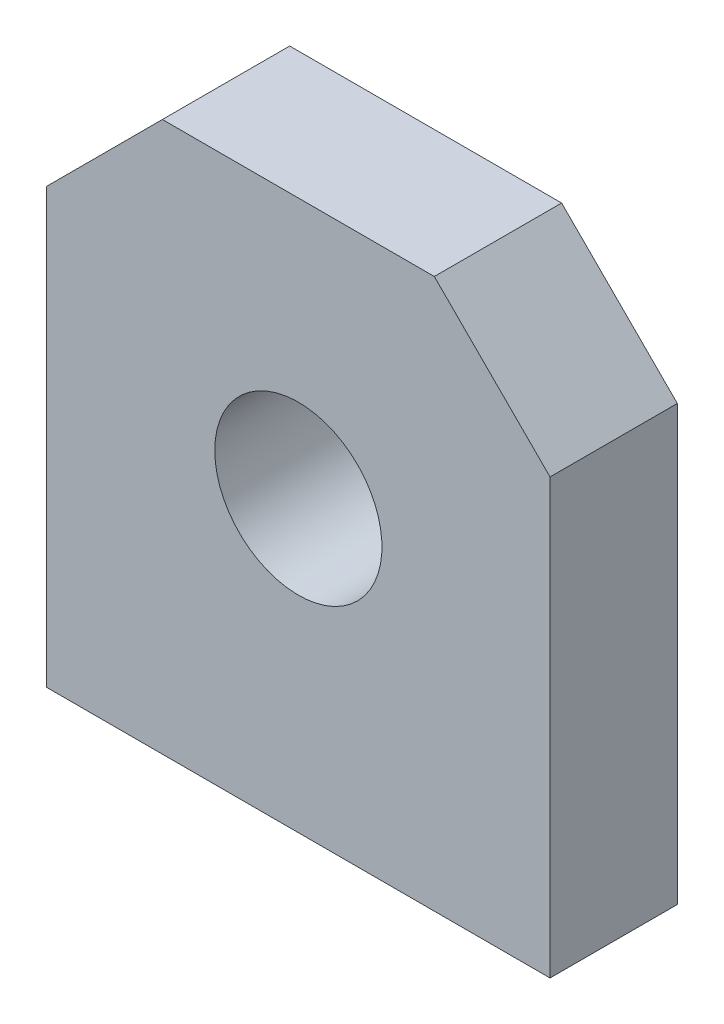
ISO-10303-21;
HEADER;
FILE_DESCRIPTION(('STEP AP214'),'2;1');
FILE_NAME('part.step','',(''),(''),'','','');
FILE_SCHEMA(('AUTOMOTIVE_DESIGN { 1 0 10303 214 1 1 1 1 }'));
ENDSEC;
DATA;
#1=APPLICATION_CONTEXT('core data for automotive mechanical design processes');
#2=APPLICATION_PROTOCOL_DEFINITION('international standard','automotive_design',2000,#1);
#3=PRODUCT_CONTEXT('',#1,'mechanical');
#4=PRODUCT('Part','Part','',(#3));
#5=PRODUCT_RELATED_PRODUCT_CATEGORY('part','',(#4));
#6=PRODUCT_DEFINITION_FORMATION('','',#4);
#7=PRODUCT_DEFINITION_CONTEXT('part definition',#1,'design');
#8=PRODUCT_DEFINITION('design','',#6,#7);
#9=PRODUCT_DEFINITION_SHAPE('','',#8);
#10=(LENGTH_UNIT() NAMED_UNIT(*) SI_UNIT(.MILLI.,.METRE.));
#11=(NAMED_UNIT(*) PLANE_ANGLE_UNIT() SI_UNIT($,.RADIAN.));
#12=(NAMED_UNIT(*) SI_UNIT($,.STERADIAN.) SOLID_ANGLE_UNIT());
#13=UNCERTAINTY_MEASURE_WITH_UNIT(LENGTH_MEASURE(1.E-05),#10,'distance_accuracy_value','');
#14=(GEOMETRIC_REPRESENTATION_CONTEXT(3) GLOBAL_UNCERTAINTY_ASSIGNED_CONTEXT((#13)) GLOBAL_UNIT_ASSIGNED_CONTEXT((#10,
#11,#12)) REPRESENTATION_CONTEXT('',''));
#15=CARTESIAN_POINT('',(0.,0.,0.));
#16=DIRECTION('',(0.,0.,1.));
#17=DIRECTION('',(1.,0.,0.));
#18=AXIS2_PLACEMENT_3D('',#15,#16,#17);
#19=CARTESIAN_POINT('',(-5.52450000000001,-6.03250000000002,2.794));
#20=DIRECTION('',(1.,0.,0.));
#21=DIRECTION('',(0.,0.,-1.));
#22=AXIS2_PLACEMENT_3D('',#19,#20,#21);
#23=PLANE('',#22);
#24=DIRECTION('',(0.,-1.,0.));
#25=VECTOR('',#24,1.);
#26=CARTESIAN_POINT('',(-5.52450000000001,-6.03250000000002,0.));
#27=LINE('',#26,#25);
#28=CARTESIAN_POINT('',(-5.52450000000001,3.49249999999998,0.));
#29=VERTEX_POINT('',#28);
#30=CARTESIAN_POINT('',(-5.52450000000001,-6.03250000000002,0.));
#31=VERTEX_POINT('',#30);
#32=EDGE_CURVE('E117',#29,#31,#27,.T.);
#33=ORIENTED_EDGE('',*,*,#32,.T.);
#34=DIRECTION('',(0.,0.,-1.));
#35=VECTOR('',#34,1.);
#36=CARTESIAN_POINT('',(-5.52450000000001,-6.03250000000002,2.794));
#37=LINE('',#36,#35);
#38=CARTESIAN_POINT('',(-5.52450000000001,-6.03250000000002,2.794));
#39=VERTEX_POINT('',#38);
#40=EDGE_CURVE('E11',#39,#31,#37,.T.);
#41=ORIENTED_EDGE('',*,*,#40,.F.);
#42=DIRECTION('',(0.,-1.,0.));
#43=VECTOR('',#42,1.);
#44=CARTESIAN_POINT('',(-5.52450000000001,-6.03250000000002,2.794));
#45=LINE('',#44,#43);
#46=CARTESIAN_POINT('',(-5.52450000000001,3.49249999999998,2.794));
#47=VERTEX_POINT('',#46);
#48=EDGE_CURVE('E128',#47,#39,#45,.T.);
#49=ORIENTED_EDGE('',*,*,#48,.F.);
#50=DIRECTION('',(0.,0.,-1.));
#51=VECTOR('',#50,1.);
#52=CARTESIAN_POINT('',(-5.52450000000001,3.49249999999998,2.794));
#53=LINE('',#52,#51);
#54=EDGE_CURVE('E113',#47,#29,#53,.T.);
#55=ORIENTED_EDGE('',*,*,#54,.T.);
#56=EDGE_LOOP('',(#33,#41,#49,#55));
#57=FACE_BOUND('',#56,.T.);
#58=ADVANCED_FACE('F33',(#57),#23,.F.);
#59=CARTESIAN_POINT('',(-5.52450000000001,-6.03250000000002,2.794));
#60=DIRECTION('',(0.,1.,0.));
#61=DIRECTION('',(0.,0.,1.));
#62=AXIS2_PLACEMENT_3D('',#59,#60,#61);
#63=PLANE('',#62);
#64=DIRECTION('',(1.,0.,0.));
#65=VECTOR('',#64,1.);
#66=CARTESIAN_POINT('',(-5.52450000000001,-6.03250000000002,0.));
#67=LINE('',#66,#65);
#68=CARTESIAN_POINT('',(5.52449999999999,-6.03250000000002,0.));
#69=VERTEX_POINT('',#68);
#70=EDGE_CURVE('E120',#31,#69,#67,.T.);
#71=ORIENTED_EDGE('',*,*,#70,.T.);
#72=DIRECTION('',(0.,0.,-1.));
#73=VECTOR('',#72,1.);
#74=CARTESIAN_POINT('',(5.52449999999999,-6.03250000000002,2.794));
#75=LINE('',#74,#73);
#76=CARTESIAN_POINT('',(5.52449999999999,-6.03250000000002,2.794));
#77=VERTEX_POINT('',#76);
#78=EDGE_CURVE('E41',#77,#69,#75,.T.);
#79=ORIENTED_EDGE('',*,*,#78,.F.);
#80=DIRECTION('',(1.,0.,0.));
#81=VECTOR('',#80,1.);
#82=CARTESIAN_POINT('',(-5.52450000000001,-6.03250000000002,2.794));
#83=LINE('',#82,#81);
#84=EDGE_CURVE('E86',#39,#77,#83,.T.);
#85=ORIENTED_EDGE('',*,*,#84,.F.);
#86=ORIENTED_EDGE('',*,*,#40,.T.);
#87=EDGE_LOOP('',(#71,#79,#85,#86));
#88=FACE_BOUND('',#87,.T.);
#89=ADVANCED_FACE('F153',(#88),#63,.F.);
#90=CARTESIAN_POINT('',(5.52449999999999,-6.03250000000002,2.794));
#91=DIRECTION('',(-1.,0.,0.));
#92=DIRECTION('',(0.,0.,1.));
#93=AXIS2_PLACEMENT_3D('',#90,#91,#92);
#94=PLANE('',#93);
#95=DIRECTION('',(0.,1.,0.));
#96=VECTOR('',#95,1.);
#97=CARTESIAN_POINT('',(5.52449999999999,-6.03250000000002,0.));
#98=LINE('',#97,#96);
#99=CARTESIAN_POINT('',(5.52449999999999,3.49249999999998,0.));
#100=VERTEX_POINT('',#99);
#101=EDGE_CURVE('E123',#69,#100,#98,.T.);
#102=ORIENTED_EDGE('',*,*,#101,.T.);
#103=DIRECTION('',(0.,0.,-1.));
#104=VECTOR('',#103,1.);
#105=CARTESIAN_POINT('',(5.52449999999999,3.49249999999998,2.794));
#106=LINE('',#105,#104);
#107=CARTESIAN_POINT('',(5.52449999999999,3.49249999999998,2.794));
#108=VERTEX_POINT('',#107);
#109=EDGE_CURVE('E108',#108,#100,#106,.T.);
#110=ORIENTED_EDGE('',*,*,#109,.F.);
#111=DIRECTION('',(0.,1.,0.));
#112=VECTOR('',#111,1.);
#113=CARTESIAN_POINT('',(5.52449999999999,-6.03250000000002,2.794));
#114=LINE('',#113,#112);
#115=EDGE_CURVE('E99',#77,#108,#114,.T.);
#116=ORIENTED_EDGE('',*,*,#115,.F.);
#117=ORIENTED_EDGE('',*,*,#78,.T.);
#118=EDGE_LOOP('',(#102,#110,#116,#117));
#119=FACE_BOUND('',#118,.T.);
#120=ADVANCED_FACE('F134',(#119),#94,.F.);
#121=CARTESIAN_POINT('',(5.52449999999999,3.49249999999998,2.794));
#122=DIRECTION('',(-0.707106781186548,-0.707106781186548,0.));
#123=DIRECTION('',(0.707106781186548,-0.707106781186548,0.));
#124=AXIS2_PLACEMENT_3D('',#121,#122,#123);
#125=PLANE('',#124);
#126=DIRECTION('',(-0.707106781186548,0.707106781186548,0.));
#127=VECTOR('',#126,1.);
#128=CARTESIAN_POINT('',(5.52449999999999,3.49249999999998,0.));
#129=LINE('',#128,#127);
#130=CARTESIAN_POINT('',(2.98449999999999,6.03249999999998,0.));
#131=VERTEX_POINT('',#130);
#132=EDGE_CURVE('E107',#100,#131,#129,.T.);
#133=ORIENTED_EDGE('',*,*,#132,.T.);
#134=DIRECTION('',(0.,0.,-1.));
#135=VECTOR('',#134,1.);
#136=CARTESIAN_POINT('',(2.98449999999999,6.03249999999998,2.794));
#137=LINE('',#136,#135);
#138=CARTESIAN_POINT('',(2.98449999999999,6.03249999999998,2.794));
#139=VERTEX_POINT('',#138);
#140=EDGE_CURVE('E104',#139,#131,#137,.T.);
#141=ORIENTED_EDGE('',*,*,#140,.F.);
#142=DIRECTION('',(-0.707106781186548,0.707106781186548,0.));
#143=VECTOR('',#142,1.);
#144=CARTESIAN_POINT('',(5.52449999999999,3.49249999999998,2.794));
#145=LINE('',#144,#143);
#146=EDGE_CURVE('E93',#108,#139,#145,.T.);
#147=ORIENTED_EDGE('',*,*,#146,.F.);
#148=ORIENTED_EDGE('',*,*,#109,.T.);
#149=EDGE_LOOP('',(#133,#141,#147,#148));
#150=FACE_BOUND('',#149,.T.);
#151=ADVANCED_FACE('F105',(#150),#125,.F.);
#152=CARTESIAN_POINT('',(-2.98450000000001,6.03249999999998,2.794));
#153=DIRECTION('',(0.,-1.,0.));
#154=DIRECTION('',(0.,0.,-1.));
#155=AXIS2_PLACEMENT_3D('',#152,#153,#154);
#156=PLANE('',#155);
#157=DIRECTION('',(-1.,0.,0.));
#158=VECTOR('',#157,1.);
#159=CARTESIAN_POINT('',(-2.98450000000001,6.03249999999998,0.));
#160=LINE('',#159,#158);
#161=CARTESIAN_POINT('',(-2.98450000000001,6.03249999999998,0.));
#162=VERTEX_POINT('',#161);
#163=EDGE_CURVE('E72',#131,#162,#160,.T.);
#164=ORIENTED_EDGE('',*,*,#163,.T.);
#165=DIRECTION('',(0.,0.,-1.));
#166=VECTOR('',#165,1.);
#167=CARTESIAN_POINT('',(-2.98450000000001,6.03249999999998,2.794));
#168=LINE('',#167,#166);
#169=CARTESIAN_POINT('',(-2.98450000000001,6.03249999999998,2.794));
#170=VERTEX_POINT('',#169);
#171=EDGE_CURVE('E109',#170,#162,#168,.T.);
#172=ORIENTED_EDGE('',*,*,#171,.F.);
#173=DIRECTION('',(-1.,0.,0.));
#174=VECTOR('',#173,1.);
#175=CARTESIAN_POINT('',(-2.98450000000001,6.03249999999998,2.794));
#176=LINE('',#175,#174);
#177=EDGE_CURVE('E97',#139,#170,#176,.T.);
#178=ORIENTED_EDGE('',*,*,#177,.F.);
#179=ORIENTED_EDGE('',*,*,#140,.T.);
#180=EDGE_LOOP('',(#164,#172,#178,#179));
#181=FACE_BOUND('',#180,.T.);
#182=ADVANCED_FACE('F111',(#181),#156,.F.);
#183=CARTESIAN_POINT('',(-5.52450000000001,3.49249999999998,2.794));
#184=DIRECTION('',(0.707106781186548,-0.707106781186548,0.));
#185=DIRECTION('',(0.707106781186548,0.707106781186548,0.));
#186=AXIS2_PLACEMENT_3D('',#183,#184,#185);
#187=PLANE('',#186);
#188=DIRECTION('',(-0.707106781186548,-0.707106781186548,0.));
#189=VECTOR('',#188,1.);
#190=CARTESIAN_POINT('',(-5.52450000000001,3.49249999999998,0.));
#191=LINE('',#190,#189);
#192=EDGE_CURVE('E78',#162,#29,#191,.T.);
#193=ORIENTED_EDGE('',*,*,#192,.T.);
#194=ORIENTED_EDGE('',*,*,#54,.F.);
#195=DIRECTION('',(-0.707106781186548,-0.707106781186548,0.));
#196=VECTOR('',#195,1.);
#197=CARTESIAN_POINT('',(-5.52450000000001,3.49249999999998,2.794));
#198=LINE('',#197,#196);
#199=EDGE_CURVE('E49',#170,#47,#198,.T.);
#200=ORIENTED_EDGE('',*,*,#199,.F.);
#201=ORIENTED_EDGE('',*,*,#171,.T.);
#202=EDGE_LOOP('',(#193,#194,#200,#201));
#203=FACE_BOUND('',#202,.T.);
#204=ADVANCED_FACE('F141',(#203),#187,.F.);
#205=CARTESIAN_POINT('',(0.,0.,2.794));
#206=DIRECTION('',(0.,0.,-1.));
#207=DIRECTION('',(-1.,0.,0.));
#208=AXIS2_PLACEMENT_3D('',#205,#206,#207);
#209=PLANE('',#208);
#210=CARTESIAN_POINT('',(0.,0.317499999999983,2.794));
#211=DIRECTION('',(0.,0.,-1.));
#212=DIRECTION('',(-1.,0.,0.));
#213=AXIS2_PLACEMENT_3D('',#210,#211,#212);
#214=CIRCLE('',#213,1.83490277815778);
#215=CARTESIAN_POINT('',(-1.83490277815778,0.317499999999983,2.794));
#216=VERTEX_POINT('',#215);
#217=EDGE_CURVE('E121',#216,#216,#214,.T.);
#218=ORIENTED_EDGE('',*,*,#217,.T.);
#219=EDGE_LOOP('',(#218));
#220=FACE_BOUND('',#219,.T.);
#221=ORIENTED_EDGE('',*,*,#48,.T.);
#222=ORIENTED_EDGE('',*,*,#84,.T.);
#223=ORIENTED_EDGE('',*,*,#115,.T.);
#224=ORIENTED_EDGE('',*,*,#146,.T.);
#225=ORIENTED_EDGE('',*,*,#177,.T.);
#226=ORIENTED_EDGE('',*,*,#199,.T.);
#227=EDGE_LOOP('',(#221,#222,#223,#224,#225,#226));
#228=FACE_BOUND('',#227,.T.);
#229=ADVANCED_FACE('F95',(#220,#228),#209,.F.);
#230=CARTESIAN_POINT('',(0.,0.,0.));
#231=DIRECTION('',(0.,0.,-1.));
#232=DIRECTION('',(-1.,0.,0.));
#233=AXIS2_PLACEMENT_3D('',#230,#231,#232);
#234=PLANE('',#233);
#235=CARTESIAN_POINT('',(0.,0.317499999999983,0.));
#236=DIRECTION('',(0.,0.,-1.));
#237=DIRECTION('',(-1.,0.,0.));
#238=AXIS2_PLACEMENT_3D('',#235,#236,#237);
#239=CIRCLE('',#238,1.83490277815778);
#240=CARTESIAN_POINT('',(-1.83490277815778,0.317499999999983,0.));
#241=VERTEX_POINT('',#240);
#242=EDGE_CURVE('E208',#241,#241,#239,.T.);
#243=ORIENTED_EDGE('',*,*,#242,.F.);
#244=EDGE_LOOP('',(#243));
#245=FACE_BOUND('',#244,.T.);
#246=ORIENTED_EDGE('',*,*,#32,.F.);
#247=ORIENTED_EDGE('',*,*,#192,.F.);
#248=ORIENTED_EDGE('',*,*,#163,.F.);
#249=ORIENTED_EDGE('',*,*,#132,.F.);
#250=ORIENTED_EDGE('',*,*,#101,.F.);
#251=ORIENTED_EDGE('',*,*,#70,.F.);
#252=EDGE_LOOP('',(#246,#247,#248,#249,#250,#251));
#253=FACE_BOUND('',#252,.T.);
#254=ADVANCED_FACE('F137',(#245,#253),#234,.T.);
#255=CARTESIAN_POINT('',(0.,0.317499999999983,2.794));
#256=DIRECTION('',(0.,0.,-1.));
#257=DIRECTION('',(-1.,0.,0.));
#258=AXIS2_PLACEMENT_3D('',#255,#256,#257);
#259=CYLINDRICAL_SURFACE('',#258,1.83490277815778);
#260=ORIENTED_EDGE('',*,*,#217,.F.);
#261=EDGE_LOOP('',(#260));
#262=FACE_BOUND('',#261,.T.);
#263=ORIENTED_EDGE('',*,*,#242,.T.);
#264=EDGE_LOOP('',(#263));
#265=FACE_BOUND('',#264,.T.);
#266=ADVANCED_FACE('F190',(#262,#265),#259,.F.);
#267=CLOSED_SHELL('',(#58,#89,#120,#151,#182,#204,#229,#254,#266));
#268=MANIFOLD_SOLID_BREP('B2',#267);
#269=ADVANCED_BREP_SHAPE_REPRESENTATION('',(#18,#268),#14);
#270=SHAPE_DEFINITION_REPRESENTATION(#9,#269);
ENDSEC;
END-ISO-10303-21;
